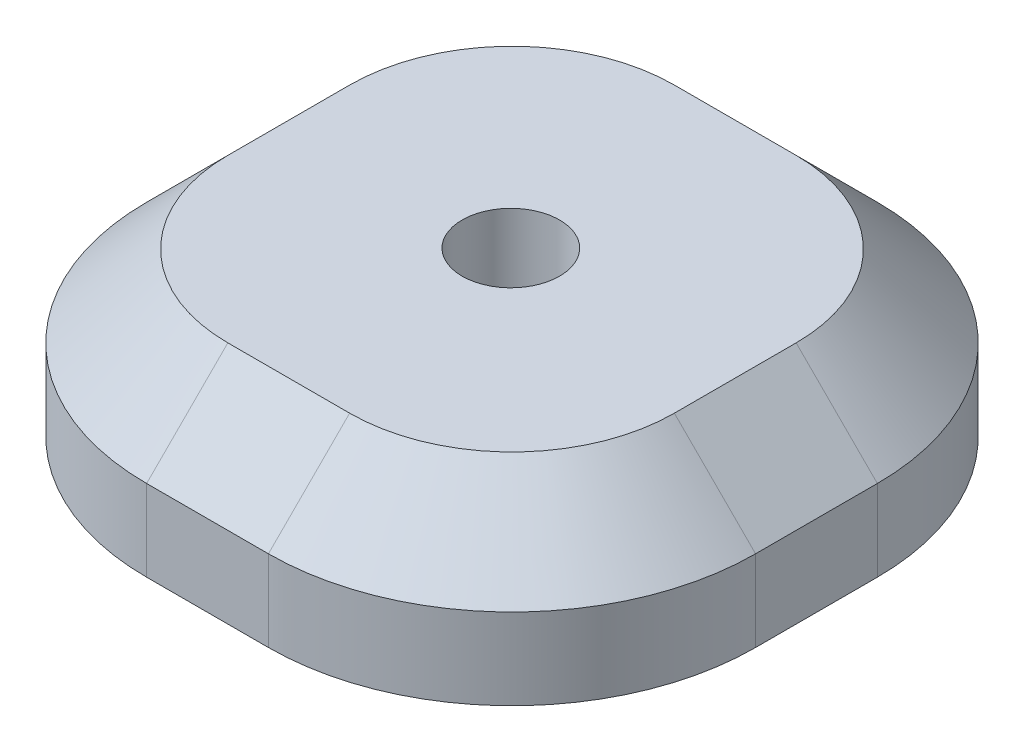
ISO-10303-21;
HEADER;
FILE_DESCRIPTION(('STEP AP214'),'2;1');
FILE_NAME('part.step','',(''),(''),'','','');
FILE_SCHEMA(('AUTOMOTIVE_DESIGN { 1 0 10303 214 1 1 1 1 }'));
ENDSEC;
DATA;
#1=APPLICATION_CONTEXT('core data for automotive mechanical design processes');
#2=APPLICATION_PROTOCOL_DEFINITION('international standard','automotive_design',2000,#1);
#3=PRODUCT_CONTEXT('',#1,'mechanical');
#4=PRODUCT('Part','Part','',(#3));
#5=PRODUCT_RELATED_PRODUCT_CATEGORY('part','',(#4));
#6=PRODUCT_DEFINITION_FORMATION('','',#4);
#7=PRODUCT_DEFINITION_CONTEXT('part definition',#1,'design');
#8=PRODUCT_DEFINITION('design','',#6,#7);
#9=PRODUCT_DEFINITION_SHAPE('','',#8);
#10=(LENGTH_UNIT() NAMED_UNIT(*) SI_UNIT(.MILLI.,.METRE.));
#11=(NAMED_UNIT(*) PLANE_ANGLE_UNIT() SI_UNIT($,.RADIAN.));
#12=(NAMED_UNIT(*) SI_UNIT($,.STERADIAN.) SOLID_ANGLE_UNIT());
#13=UNCERTAINTY_MEASURE_WITH_UNIT(LENGTH_MEASURE(1.E-05),#10,'distance_accuracy_value','');
#14=(GEOMETRIC_REPRESENTATION_CONTEXT(3) GLOBAL_UNCERTAINTY_ASSIGNED_CONTEXT((#13)) GLOBAL_UNIT_ASSIGNED_CONTEXT((#10,
#11,#12)) REPRESENTATION_CONTEXT('',''));
#15=CARTESIAN_POINT('',(0.,0.,0.));
#16=DIRECTION('',(0.,0.,1.));
#17=DIRECTION('',(1.,0.,0.));
#18=AXIS2_PLACEMENT_3D('',#15,#16,#17);
#19=CARTESIAN_POINT('',(0.,20.,0.));
#20=DIRECTION('',(1.,0.,0.));
#21=DIRECTION('',(0.,0.,-1.));
#22=AXIS2_PLACEMENT_3D('',#19,#20,#21);
#23=PLANE('',#22);
#24=DIRECTION('',(0.,-1.,0.));
#25=VECTOR('',#24,1.);
#26=CARTESIAN_POINT('',(0.,20.,-30.));
#27=LINE('',#26,#25);
#28=CARTESIAN_POINT('',(0.,0.,-30.));
#29=VERTEX_POINT('',#28);
#30=CARTESIAN_POINT('',(0.,9.99999999999996,-30.));
#31=VERTEX_POINT('',#30);
#32=EDGE_CURVE('E192',#29,#31,#27,.F.);
#33=ORIENTED_EDGE('',*,*,#32,.T.);
#34=DIRECTION('',(0.,0.,-1.));
#35=VECTOR('',#34,1.);
#36=CARTESIAN_POINT('',(0.,9.99999999999996,0.));
#37=LINE('',#36,#35);
#38=CARTESIAN_POINT('',(0.,9.99999999999996,-45.));
#39=VERTEX_POINT('',#38);
#40=EDGE_CURVE('E236',#31,#39,#37,.T.);
#41=ORIENTED_EDGE('',*,*,#40,.T.);
#42=DIRECTION('',(0.,-1.,0.));
#43=VECTOR('',#42,1.);
#44=CARTESIAN_POINT('',(0.,20.,-45.));
#45=LINE('',#44,#43);
#46=CARTESIAN_POINT('',(0.,0.,-45.));
#47=VERTEX_POINT('',#46);
#48=EDGE_CURVE('E195',#39,#47,#45,.T.);
#49=ORIENTED_EDGE('',*,*,#48,.T.);
#50=DIRECTION('',(0.,0.,1.));
#51=VECTOR('',#50,1.);
#52=CARTESIAN_POINT('',(0.,0.,0.));
#53=LINE('',#52,#51);
#54=EDGE_CURVE('E180',#47,#29,#53,.T.);
#55=ORIENTED_EDGE('',*,*,#54,.T.);
#56=EDGE_LOOP('',(#33,#41,#49,#55));
#57=FACE_BOUND('',#56,.T.);
#58=ADVANCED_FACE('F37',(#57),#23,.F.);
#59=CARTESIAN_POINT('',(0.,20.,0.));
#60=DIRECTION('',(0.,0.,-1.));
#61=DIRECTION('',(-1.,0.,0.));
#62=AXIS2_PLACEMENT_3D('',#59,#60,#61);
#63=PLANE('',#62);
#64=DIRECTION('',(0.,-1.,0.));
#65=VECTOR('',#64,1.);
#66=CARTESIAN_POINT('',(45.,20.,0.));
#67=LINE('',#66,#65);
#68=CARTESIAN_POINT('',(45.,0.,0.));
#69=VERTEX_POINT('',#68);
#70=CARTESIAN_POINT('',(45.,9.99999999999996,0.));
#71=VERTEX_POINT('',#70);
#72=EDGE_CURVE('E216',#69,#71,#67,.F.);
#73=ORIENTED_EDGE('',*,*,#72,.T.);
#74=DIRECTION('',(-1.,0.,0.));
#75=VECTOR('',#74,1.);
#76=CARTESIAN_POINT('',(0.,9.99999999999996,0.));
#77=LINE('',#76,#75);
#78=CARTESIAN_POINT('',(30.,9.99999999999996,0.));
#79=VERTEX_POINT('',#78);
#80=EDGE_CURVE('E243',#71,#79,#77,.T.);
#81=ORIENTED_EDGE('',*,*,#80,.T.);
#82=DIRECTION('',(0.,-1.,0.));
#83=VECTOR('',#82,1.);
#84=CARTESIAN_POINT('',(30.,20.,0.));
#85=LINE('',#84,#83);
#86=CARTESIAN_POINT('',(30.,0.,0.));
#87=VERTEX_POINT('',#86);
#88=EDGE_CURVE('E214',#79,#87,#85,.T.);
#89=ORIENTED_EDGE('',*,*,#88,.T.);
#90=DIRECTION('',(1.,0.,0.));
#91=VECTOR('',#90,1.);
#92=CARTESIAN_POINT('',(0.,0.,0.));
#93=LINE('',#92,#91);
#94=EDGE_CURVE('E183',#87,#69,#93,.T.);
#95=ORIENTED_EDGE('',*,*,#94,.T.);
#96=EDGE_LOOP('',(#73,#81,#89,#95));
#97=FACE_BOUND('',#96,.T.);
#98=ADVANCED_FACE('F286',(#97),#63,.F.);
#99=CARTESIAN_POINT('',(75.,20.,0.));
#100=DIRECTION('',(-1.,0.,0.));
#101=DIRECTION('',(0.,0.,1.));
#102=AXIS2_PLACEMENT_3D('',#99,#100,#101);
#103=PLANE('',#102);
#104=DIRECTION('',(0.,-1.,0.));
#105=VECTOR('',#104,1.);
#106=CARTESIAN_POINT('',(75.,20.,-45.));
#107=LINE('',#106,#105);
#108=CARTESIAN_POINT('',(75.,0.,-45.));
#109=VERTEX_POINT('',#108);
#110=CARTESIAN_POINT('',(75.,9.99999999999996,-45.));
#111=VERTEX_POINT('',#110);
#112=EDGE_CURVE('E212',#109,#111,#107,.F.);
#113=ORIENTED_EDGE('',*,*,#112,.T.);
#114=DIRECTION('',(0.,0.,1.));
#115=VECTOR('',#114,1.);
#116=CARTESIAN_POINT('',(75.,9.99999999999996,0.));
#117=LINE('',#116,#115);
#118=CARTESIAN_POINT('',(75.,9.99999999999996,-30.));
#119=VERTEX_POINT('',#118);
#120=EDGE_CURVE('E11',#111,#119,#117,.T.);
#121=ORIENTED_EDGE('',*,*,#120,.T.);
#122=DIRECTION('',(0.,-1.,0.));
#123=VECTOR('',#122,1.);
#124=CARTESIAN_POINT('',(75.,20.,-30.));
#125=LINE('',#124,#123);
#126=CARTESIAN_POINT('',(75.,0.,-30.));
#127=VERTEX_POINT('',#126);
#128=EDGE_CURVE('E210',#119,#127,#125,.T.);
#129=ORIENTED_EDGE('',*,*,#128,.T.);
#130=DIRECTION('',(0.,0.,-1.));
#131=VECTOR('',#130,1.);
#132=CARTESIAN_POINT('',(75.,0.,0.));
#133=LINE('',#132,#131);
#134=EDGE_CURVE('E186',#127,#109,#133,.T.);
#135=ORIENTED_EDGE('',*,*,#134,.T.);
#136=EDGE_LOOP('',(#113,#121,#129,#135));
#137=FACE_BOUND('',#136,.T.);
#138=ADVANCED_FACE('F296',(#137),#103,.F.);
#139=CARTESIAN_POINT('',(0.,20.,-75.));
#140=DIRECTION('',(0.,0.,1.));
#141=DIRECTION('',(1.,0.,0.));
#142=AXIS2_PLACEMENT_3D('',#139,#140,#141);
#143=PLANE('',#142);
#144=DIRECTION('',(0.,-1.,0.));
#145=VECTOR('',#144,1.);
#146=CARTESIAN_POINT('',(30.,20.,-75.));
#147=LINE('',#146,#145);
#148=CARTESIAN_POINT('',(30.,0.,-75.));
#149=VERTEX_POINT('',#148);
#150=CARTESIAN_POINT('',(30.,9.99999999999996,-75.));
#151=VERTEX_POINT('',#150);
#152=EDGE_CURVE('E207',#149,#151,#147,.F.);
#153=ORIENTED_EDGE('',*,*,#152,.T.);
#154=DIRECTION('',(1.,0.,0.));
#155=VECTOR('',#154,1.);
#156=CARTESIAN_POINT('',(0.,9.99999999999996,-75.));
#157=LINE('',#156,#155);
#158=CARTESIAN_POINT('',(45.,9.99999999999996,-75.));
#159=VERTEX_POINT('',#158);
#160=EDGE_CURVE('E245',#151,#159,#157,.T.);
#161=ORIENTED_EDGE('',*,*,#160,.T.);
#162=DIRECTION('',(0.,-1.,0.));
#163=VECTOR('',#162,1.);
#164=CARTESIAN_POINT('',(45.,20.,-75.));
#165=LINE('',#164,#163);
#166=CARTESIAN_POINT('',(45.,0.,-75.));
#167=VERTEX_POINT('',#166);
#168=EDGE_CURVE('E205',#159,#167,#165,.T.);
#169=ORIENTED_EDGE('',*,*,#168,.T.);
#170=DIRECTION('',(-1.,0.,0.));
#171=VECTOR('',#170,1.);
#172=CARTESIAN_POINT('',(0.,0.,-75.));
#173=LINE('',#172,#171);
#174=EDGE_CURVE('E189',#167,#149,#173,.T.);
#175=ORIENTED_EDGE('',*,*,#174,.T.);
#176=EDGE_LOOP('',(#153,#161,#169,#175));
#177=FACE_BOUND('',#176,.T.);
#178=ADVANCED_FACE('F301',(#177),#143,.F.);
#179=CARTESIAN_POINT('',(0.,20.,0.));
#180=DIRECTION('',(0.,-1.,0.));
#181=DIRECTION('',(0.,0.,-1.));
#182=AXIS2_PLACEMENT_3D('',#179,#180,#181);
#183=PLANE('',#182);
#184=CARTESIAN_POINT('',(37.318018893302,20.,-37.5396086087108));
#185=DIRECTION('',(0.,1.,0.));
#186=DIRECTION('',(0.,0.,1.));
#187=AXIS2_PLACEMENT_3D('',#184,#185,#186);
#188=CIRCLE('',#187,5.99999999999999);
#189=CARTESIAN_POINT('',(37.318018893302,20.,-31.5396086087108));
#190=VERTEX_POINT('',#189);
#191=EDGE_CURVE('E151',#190,#190,#188,.T.);
#192=ORIENTED_EDGE('',*,*,#191,.F.);
#193=EDGE_LOOP('',(#192));
#194=FACE_BOUND('',#193,.T.);
#195=CARTESIAN_POINT('',(30.,20.,-45.));
#196=DIRECTION('',(0.,-1.,0.));
#197=DIRECTION('',(0.,0.,-1.));
#198=AXIS2_PLACEMENT_3D('',#195,#196,#197);
#199=CIRCLE('',#198,20.);
#200=CARTESIAN_POINT('',(30.,20.,-65.));
#201=VERTEX_POINT('',#200);
#202=CARTESIAN_POINT('',(9.99999999999998,20.,-45.));
#203=VERTEX_POINT('',#202);
#204=EDGE_CURVE('E229',#201,#203,#199,.F.);
#205=ORIENTED_EDGE('',*,*,#204,.T.);
#206=DIRECTION('',(0.,0.,1.));
#207=VECTOR('',#206,1.);
#208=CARTESIAN_POINT('',(9.99999999999998,20.,0.));
#209=LINE('',#208,#207);
#210=CARTESIAN_POINT('',(9.99999999999998,20.,-30.));
#211=VERTEX_POINT('',#210);
#212=EDGE_CURVE('E233',#203,#211,#209,.T.);
#213=ORIENTED_EDGE('',*,*,#212,.T.);
#214=CARTESIAN_POINT('',(30.,20.,-30.));
#215=DIRECTION('',(0.,-1.,0.));
#216=DIRECTION('',(0.,0.,-1.));
#217=AXIS2_PLACEMENT_3D('',#214,#215,#216);
#218=CIRCLE('',#217,20.);
#219=CARTESIAN_POINT('',(30.,20.,-9.99999999999998));
#220=VERTEX_POINT('',#219);
#221=EDGE_CURVE('E231',#211,#220,#218,.F.);
#222=ORIENTED_EDGE('',*,*,#221,.T.);
#223=DIRECTION('',(1.,0.,0.));
#224=VECTOR('',#223,1.);
#225=CARTESIAN_POINT('',(0.,20.,-9.99999999999998));
#226=LINE('',#225,#224);
#227=CARTESIAN_POINT('',(45.,20.,-9.99999999999998));
#228=VERTEX_POINT('',#227);
#229=EDGE_CURVE('E227',#220,#228,#226,.T.);
#230=ORIENTED_EDGE('',*,*,#229,.T.);
#231=CARTESIAN_POINT('',(45.,20.,-30.));
#232=DIRECTION('',(0.,-1.,0.));
#233=DIRECTION('',(0.,0.,-1.));
#234=AXIS2_PLACEMENT_3D('',#231,#232,#233);
#235=CIRCLE('',#234,20.);
#236=CARTESIAN_POINT('',(65.,20.,-30.));
#237=VERTEX_POINT('',#236);
#238=EDGE_CURVE('E223',#228,#237,#235,.F.);
#239=ORIENTED_EDGE('',*,*,#238,.T.);
#240=DIRECTION('',(0.,0.,-1.));
#241=VECTOR('',#240,1.);
#242=CARTESIAN_POINT('',(65.,20.,0.));
#243=LINE('',#242,#241);
#244=CARTESIAN_POINT('',(65.,20.,-45.));
#245=VERTEX_POINT('',#244);
#246=EDGE_CURVE('E219',#237,#245,#243,.T.);
#247=ORIENTED_EDGE('',*,*,#246,.T.);
#248=CARTESIAN_POINT('',(45.,20.,-45.));
#249=DIRECTION('',(0.,-1.,0.));
#250=DIRECTION('',(0.,0.,-1.));
#251=AXIS2_PLACEMENT_3D('',#248,#249,#250);
#252=CIRCLE('',#251,20.);
#253=CARTESIAN_POINT('',(45.,20.,-65.));
#254=VERTEX_POINT('',#253);
#255=EDGE_CURVE('E221',#245,#254,#252,.F.);
#256=ORIENTED_EDGE('',*,*,#255,.T.);
#257=DIRECTION('',(-1.,0.,0.));
#258=VECTOR('',#257,1.);
#259=CARTESIAN_POINT('',(0.,20.,-65.));
#260=LINE('',#259,#258);
#261=EDGE_CURVE('E225',#254,#201,#260,.T.);
#262=ORIENTED_EDGE('',*,*,#261,.T.);
#263=EDGE_LOOP('',(#205,#213,#222,#230,#239,#247,#256,#262));
#264=FACE_BOUND('',#263,.T.);
#265=ADVANCED_FACE('F326',(#194,#264),#183,.F.);
#266=CARTESIAN_POINT('',(0.,0.,0.));
#267=DIRECTION('',(0.,-1.,0.));
#268=DIRECTION('',(0.,0.,-1.));
#269=AXIS2_PLACEMENT_3D('',#266,#267,#268);
#270=PLANE('',#269);
#271=CARTESIAN_POINT('',(25.,0.,-25.));
#272=DIRECTION('',(0.,-1.,0.));
#273=DIRECTION('',(0.,0.,-1.));
#274=AXIS2_PLACEMENT_3D('',#271,#272,#273);
#275=CIRCLE('',#274,5.99999999999999);
#276=CARTESIAN_POINT('',(25.,0.,-31.));
#277=VERTEX_POINT('',#276);
#278=EDGE_CURVE('E150',#277,#277,#275,.T.);
#279=ORIENTED_EDGE('',*,*,#278,.F.);
#280=EDGE_LOOP('',(#279));
#281=FACE_BOUND('',#280,.T.);
#282=CARTESIAN_POINT('',(50.,0.,-25.));
#283=DIRECTION('',(0.,-1.,0.));
#284=DIRECTION('',(0.,0.,-1.));
#285=AXIS2_PLACEMENT_3D('',#282,#283,#284);
#286=CIRCLE('',#285,5.99999999999998);
#287=CARTESIAN_POINT('',(50.,0.,-31.));
#288=VERTEX_POINT('',#287);
#289=EDGE_CURVE('E161',#288,#288,#286,.T.);
#290=ORIENTED_EDGE('',*,*,#289,.F.);
#291=EDGE_LOOP('',(#290));
#292=FACE_BOUND('',#291,.T.);
#293=CARTESIAN_POINT('',(50.,0.,-50.));
#294=DIRECTION('',(0.,-1.,0.));
#295=DIRECTION('',(0.,0.,-1.));
#296=AXIS2_PLACEMENT_3D('',#293,#294,#295);
#297=CIRCLE('',#296,5.99999999999998);
#298=CARTESIAN_POINT('',(50.,0.,-56.));
#299=VERTEX_POINT('',#298);
#300=EDGE_CURVE('E167',#299,#299,#297,.T.);
#301=ORIENTED_EDGE('',*,*,#300,.F.);
#302=EDGE_LOOP('',(#301));
#303=FACE_BOUND('',#302,.T.);
#304=CARTESIAN_POINT('',(25.,0.,-50.));
#305=DIRECTION('',(0.,-1.,0.));
#306=DIRECTION('',(0.,0.,-1.));
#307=AXIS2_PLACEMENT_3D('',#304,#305,#306);
#308=CIRCLE('',#307,5.99999999999999);
#309=CARTESIAN_POINT('',(25.,0.,-56.));
#310=VERTEX_POINT('',#309);
#311=EDGE_CURVE('E173',#310,#310,#308,.T.);
#312=ORIENTED_EDGE('',*,*,#311,.F.);
#313=EDGE_LOOP('',(#312));
#314=FACE_BOUND('',#313,.T.);
#315=ORIENTED_EDGE('',*,*,#54,.F.);
#316=CARTESIAN_POINT('',(30.,0.,-45.));
#317=DIRECTION('',(0.,-1.,0.));
#318=DIRECTION('',(0.,0.,-1.));
#319=AXIS2_PLACEMENT_3D('',#316,#317,#318);
#320=CIRCLE('',#319,30.);
#321=EDGE_CURVE('E203',#47,#149,#320,.T.);
#322=ORIENTED_EDGE('',*,*,#321,.T.);
#323=ORIENTED_EDGE('',*,*,#174,.F.);
#324=CARTESIAN_POINT('',(45.,0.,-45.));
#325=DIRECTION('',(0.,-1.,0.));
#326=DIRECTION('',(0.,0.,-1.));
#327=AXIS2_PLACEMENT_3D('',#324,#325,#326);
#328=CIRCLE('',#327,30.);
#329=EDGE_CURVE('E201',#167,#109,#328,.T.);
#330=ORIENTED_EDGE('',*,*,#329,.T.);
#331=ORIENTED_EDGE('',*,*,#134,.F.);
#332=CARTESIAN_POINT('',(45.,0.,-30.));
#333=DIRECTION('',(0.,-1.,0.));
#334=DIRECTION('',(0.,0.,-1.));
#335=AXIS2_PLACEMENT_3D('',#332,#333,#334);
#336=CIRCLE('',#335,30.);
#337=EDGE_CURVE('E199',#127,#69,#336,.T.);
#338=ORIENTED_EDGE('',*,*,#337,.T.);
#339=ORIENTED_EDGE('',*,*,#94,.F.);
#340=CARTESIAN_POINT('',(30.,0.,-30.));
#341=DIRECTION('',(0.,-1.,0.));
#342=DIRECTION('',(0.,0.,-1.));
#343=AXIS2_PLACEMENT_3D('',#340,#341,#342);
#344=CIRCLE('',#343,30.);
#345=EDGE_CURVE('E197',#87,#29,#344,.T.);
#346=ORIENTED_EDGE('',*,*,#345,.T.);
#347=EDGE_LOOP('',(#315,#322,#323,#330,#331,#338,#339,#346));
#348=FACE_BOUND('',#347,.T.);
#349=ADVANCED_FACE('F292',(#281,#292,#303,#314,#348),#270,.T.);
#350=CARTESIAN_POINT('',(30.,20.,-45.));
#351=DIRECTION('',(0.,-1.,0.));
#352=DIRECTION('',(0.,0.,-1.));
#353=AXIS2_PLACEMENT_3D('',#350,#351,#352);
#354=CYLINDRICAL_SURFACE('',#353,30.);
#355=ORIENTED_EDGE('',*,*,#48,.F.);
#356=CARTESIAN_POINT('',(30.,9.99999999999996,-45.));
#357=DIRECTION('',(0.,-1.,0.));
#358=DIRECTION('',(0.,0.,-1.));
#359=AXIS2_PLACEMENT_3D('',#356,#357,#358);
#360=CIRCLE('',#359,30.);
#361=EDGE_CURVE('E241',#39,#151,#360,.T.);
#362=ORIENTED_EDGE('',*,*,#361,.T.);
#363=ORIENTED_EDGE('',*,*,#152,.F.);
#364=ORIENTED_EDGE('',*,*,#321,.F.);
#365=EDGE_LOOP('',(#355,#362,#363,#364));
#366=FACE_BOUND('',#365,.T.);
#367=ADVANCED_FACE('F305',(#366),#354,.T.);
#368=CARTESIAN_POINT('',(45.,20.,-45.));
#369=DIRECTION('',(0.,-1.,0.));
#370=DIRECTION('',(0.,0.,-1.));
#371=AXIS2_PLACEMENT_3D('',#368,#369,#370);
#372=CYLINDRICAL_SURFACE('',#371,30.);
#373=ORIENTED_EDGE('',*,*,#168,.F.);
#374=CARTESIAN_POINT('',(45.,9.99999999999996,-45.));
#375=DIRECTION('',(0.,-1.,0.));
#376=DIRECTION('',(0.,0.,-1.));
#377=AXIS2_PLACEMENT_3D('',#374,#375,#376);
#378=CIRCLE('',#377,30.);
#379=EDGE_CURVE('E46',#159,#111,#378,.T.);
#380=ORIENTED_EDGE('',*,*,#379,.T.);
#381=ORIENTED_EDGE('',*,*,#112,.F.);
#382=ORIENTED_EDGE('',*,*,#329,.F.);
#383=EDGE_LOOP('',(#373,#380,#381,#382));
#384=FACE_BOUND('',#383,.T.);
#385=ADVANCED_FACE('F297',(#384),#372,.T.);
#386=CARTESIAN_POINT('',(45.,20.,-30.));
#387=DIRECTION('',(0.,-1.,0.));
#388=DIRECTION('',(0.,0.,-1.));
#389=AXIS2_PLACEMENT_3D('',#386,#387,#388);
#390=CYLINDRICAL_SURFACE('',#389,30.);
#391=ORIENTED_EDGE('',*,*,#128,.F.);
#392=CARTESIAN_POINT('',(45.,9.99999999999996,-30.));
#393=DIRECTION('',(0.,-1.,0.));
#394=DIRECTION('',(0.,0.,-1.));
#395=AXIS2_PLACEMENT_3D('',#392,#393,#394);
#396=CIRCLE('',#395,30.);
#397=EDGE_CURVE('E247',#119,#71,#396,.T.);
#398=ORIENTED_EDGE('',*,*,#397,.T.);
#399=ORIENTED_EDGE('',*,*,#72,.F.);
#400=ORIENTED_EDGE('',*,*,#337,.F.);
#401=EDGE_LOOP('',(#391,#398,#399,#400));
#402=FACE_BOUND('',#401,.T.);
#403=ADVANCED_FACE('F283',(#402),#390,.T.);
#404=CARTESIAN_POINT('',(30.,20.,-30.));
#405=DIRECTION('',(0.,-1.,0.));
#406=DIRECTION('',(0.,0.,-1.));
#407=AXIS2_PLACEMENT_3D('',#404,#405,#406);
#408=CYLINDRICAL_SURFACE('',#407,30.);
#409=ORIENTED_EDGE('',*,*,#88,.F.);
#410=CARTESIAN_POINT('',(30.,9.99999999999996,-30.));
#411=DIRECTION('',(0.,-1.,0.));
#412=DIRECTION('',(0.,0.,-1.));
#413=AXIS2_PLACEMENT_3D('',#410,#411,#412);
#414=CIRCLE('',#413,30.);
#415=EDGE_CURVE('E239',#79,#31,#414,.T.);
#416=ORIENTED_EDGE('',*,*,#415,.T.);
#417=ORIENTED_EDGE('',*,*,#32,.F.);
#418=ORIENTED_EDGE('',*,*,#345,.F.);
#419=EDGE_LOOP('',(#409,#416,#417,#418));
#420=FACE_BOUND('',#419,.T.);
#421=ADVANCED_FACE('F354',(#420),#408,.T.);
#422=CARTESIAN_POINT('',(65.,20.,0.));
#423=DIRECTION('',(-0.707106781186549,-0.707106781186545,0.));
#424=DIRECTION('',(0.,0.,-1.));
#425=AXIS2_PLACEMENT_3D('',#422,#423,#424);
#426=PLANE('',#425);
#427=DIRECTION('',(-0.707106781186545,0.70710678118655,0.));
#428=VECTOR('',#427,1.);
#429=CARTESIAN_POINT('',(75.,9.99999999999996,-30.));
#430=LINE('',#429,#428);
#431=EDGE_CURVE('E264',#119,#237,#430,.T.);
#432=ORIENTED_EDGE('',*,*,#431,.F.);
#433=ORIENTED_EDGE('',*,*,#120,.F.);
#434=DIRECTION('',(0.707106781186545,-0.70710678118655,0.));
#435=VECTOR('',#434,1.);
#436=CARTESIAN_POINT('',(65.,20.,-45.));
#437=LINE('',#436,#435);
#438=EDGE_CURVE('E41',#245,#111,#437,.T.);
#439=ORIENTED_EDGE('',*,*,#438,.F.);
#440=ORIENTED_EDGE('',*,*,#246,.F.);
#441=EDGE_LOOP('',(#432,#433,#439,#440));
#442=FACE_BOUND('',#441,.T.);
#443=ADVANCED_FACE('F39',(#442),#426,.F.);
#444=CARTESIAN_POINT('',(45.,20.,-45.));
#445=DIRECTION('',(0.,-1.,0.));
#446=DIRECTION('',(0.,0.,-1.));
#447=AXIS2_PLACEMENT_3D('',#444,#445,#446);
#448=CONICAL_SURFACE('',#447,20.,0.785398163397446);
#449=ORIENTED_EDGE('',*,*,#438,.T.);
#450=ORIENTED_EDGE('',*,*,#379,.F.);
#451=DIRECTION('',(0.,-0.707106781186549,-0.707106781186545));
#452=VECTOR('',#451,1.);
#453=CARTESIAN_POINT('',(45.,20.,-65.));
#454=LINE('',#453,#452);
#455=EDGE_CURVE('E262',#254,#159,#454,.T.);
#456=ORIENTED_EDGE('',*,*,#455,.F.);
#457=ORIENTED_EDGE('',*,*,#255,.F.);
#458=EDGE_LOOP('',(#449,#450,#456,#457));
#459=FACE_BOUND('',#458,.T.);
#460=ADVANCED_FACE('F274',(#459),#448,.T.);
#461=CARTESIAN_POINT('',(45.,20.,-30.));
#462=DIRECTION('',(0.,-1.,0.));
#463=DIRECTION('',(0.,0.,-1.));
#464=AXIS2_PLACEMENT_3D('',#461,#462,#463);
#465=CONICAL_SURFACE('',#464,20.,0.785398163397446);
#466=ORIENTED_EDGE('',*,*,#431,.T.);
#467=ORIENTED_EDGE('',*,*,#238,.F.);
#468=DIRECTION('',(0.,0.707106781186549,-0.707106781186545));
#469=VECTOR('',#468,1.);
#470=CARTESIAN_POINT('',(45.,9.99999999999996,0.));
#471=LINE('',#470,#469);
#472=EDGE_CURVE('E259',#71,#228,#471,.T.);
#473=ORIENTED_EDGE('',*,*,#472,.F.);
#474=ORIENTED_EDGE('',*,*,#397,.F.);
#475=EDGE_LOOP('',(#466,#467,#473,#474));
#476=FACE_BOUND('',#475,.T.);
#477=ADVANCED_FACE('F279',(#476),#465,.T.);
#478=CARTESIAN_POINT('',(0.,20.,-65.));
#479=DIRECTION('',(0.,-0.707106781186545,0.707106781186549));
#480=DIRECTION('',(-1.,0.,0.));
#481=AXIS2_PLACEMENT_3D('',#478,#479,#480);
#482=PLANE('',#481);
#483=ORIENTED_EDGE('',*,*,#455,.T.);
#484=ORIENTED_EDGE('',*,*,#160,.F.);
#485=DIRECTION('',(0.,-0.70710678118655,-0.707106781186545));
#486=VECTOR('',#485,1.);
#487=CARTESIAN_POINT('',(30.,20.,-65.));
#488=LINE('',#487,#486);
#489=EDGE_CURVE('E256',#201,#151,#488,.T.);
#490=ORIENTED_EDGE('',*,*,#489,.F.);
#491=ORIENTED_EDGE('',*,*,#261,.F.);
#492=EDGE_LOOP('',(#483,#484,#490,#491));
#493=FACE_BOUND('',#492,.T.);
#494=ADVANCED_FACE('F329',(#493),#482,.F.);
#495=CARTESIAN_POINT('',(0.,20.,-9.99999999999998));
#496=DIRECTION('',(0.,-0.707106781186545,-0.707106781186549));
#497=DIRECTION('',(1.,0.,0.));
#498=AXIS2_PLACEMENT_3D('',#495,#496,#497);
#499=PLANE('',#498);
#500=ORIENTED_EDGE('',*,*,#472,.T.);
#501=ORIENTED_EDGE('',*,*,#229,.F.);
#502=DIRECTION('',(0.,0.70710678118655,-0.707106781186545));
#503=VECTOR('',#502,1.);
#504=CARTESIAN_POINT('',(30.,9.99999999999996,0.));
#505=LINE('',#504,#503);
#506=EDGE_CURVE('E253',#79,#220,#505,.T.);
#507=ORIENTED_EDGE('',*,*,#506,.F.);
#508=ORIENTED_EDGE('',*,*,#80,.F.);
#509=EDGE_LOOP('',(#500,#501,#507,#508));
#510=FACE_BOUND('',#509,.T.);
#511=ADVANCED_FACE('F331',(#510),#499,.F.);
#512=CARTESIAN_POINT('',(30.,20.,-45.));
#513=DIRECTION('',(0.,-1.,0.));
#514=DIRECTION('',(0.,0.,-1.));
#515=AXIS2_PLACEMENT_3D('',#512,#513,#514);
#516=CONICAL_SURFACE('',#515,20.,0.785398163397446);
#517=ORIENTED_EDGE('',*,*,#489,.T.);
#518=ORIENTED_EDGE('',*,*,#361,.F.);
#519=DIRECTION('',(-0.707106781186545,-0.707106781186549,0.));
#520=VECTOR('',#519,1.);
#521=CARTESIAN_POINT('',(9.99999999999998,20.,-45.));
#522=LINE('',#521,#520);
#523=EDGE_CURVE('E251',#203,#39,#522,.T.);
#524=ORIENTED_EDGE('',*,*,#523,.F.);
#525=ORIENTED_EDGE('',*,*,#204,.F.);
#526=EDGE_LOOP('',(#517,#518,#524,#525));
#527=FACE_BOUND('',#526,.T.);
#528=ADVANCED_FACE('F309',(#527),#516,.T.);
#529=CARTESIAN_POINT('',(30.,20.,-30.));
#530=DIRECTION('',(0.,-1.,0.));
#531=DIRECTION('',(0.,0.,-1.));
#532=AXIS2_PLACEMENT_3D('',#529,#530,#531);
#533=CONICAL_SURFACE('',#532,20.,0.785398163397446);
#534=ORIENTED_EDGE('',*,*,#506,.T.);
#535=ORIENTED_EDGE('',*,*,#221,.F.);
#536=DIRECTION('',(0.707106781186545,0.707106781186549,0.));
#537=VECTOR('',#536,1.);
#538=CARTESIAN_POINT('',(0.,9.99999999999996,-30.));
#539=LINE('',#538,#537);
#540=EDGE_CURVE('E179',#31,#211,#539,.T.);
#541=ORIENTED_EDGE('',*,*,#540,.F.);
#542=ORIENTED_EDGE('',*,*,#415,.F.);
#543=EDGE_LOOP('',(#534,#535,#541,#542));
#544=FACE_BOUND('',#543,.T.);
#545=ADVANCED_FACE('F322',(#544),#533,.T.);
#546=CARTESIAN_POINT('',(9.99999999999998,20.,0.));
#547=DIRECTION('',(0.707106781186549,-0.707106781186545,0.));
#548=DIRECTION('',(0.,0.,1.));
#549=AXIS2_PLACEMENT_3D('',#546,#547,#548);
#550=PLANE('',#549);
#551=ORIENTED_EDGE('',*,*,#523,.T.);
#552=ORIENTED_EDGE('',*,*,#40,.F.);
#553=ORIENTED_EDGE('',*,*,#540,.T.);
#554=ORIENTED_EDGE('',*,*,#212,.F.);
#555=EDGE_LOOP('',(#551,#552,#553,#554));
#556=FACE_BOUND('',#555,.T.);
#557=ADVANCED_FACE('F318',(#556),#550,.F.);
#558=CARTESIAN_POINT('',(25.,9.99999999999999,-50.));
#559=DIRECTION('',(0.,-1.,0.));
#560=DIRECTION('',(0.,0.,-1.));
#561=AXIS2_PLACEMENT_3D('',#558,#559,#560);
#562=CONICAL_SURFACE('',#561,5.99999999999999,1.02974425867666);
#563=CARTESIAN_POINT('',(25.,13.6051637141653,-50.));
#564=VERTEX_POINT('',#563);
#565=VERTEX_LOOP('',#564);
#566=FACE_BOUND('',#565,.T.);
#567=CARTESIAN_POINT('',(25.,9.99999999999999,-50.));
#568=DIRECTION('',(0.,-1.,0.));
#569=DIRECTION('',(0.,0.,-1.));
#570=AXIS2_PLACEMENT_3D('',#567,#568,#569);
#571=CIRCLE('',#570,5.99999999999999);
#572=CARTESIAN_POINT('',(25.,9.99999999999999,-56.));
#573=VERTEX_POINT('',#572);
#574=EDGE_CURVE('E176',#573,#573,#571,.T.);
#575=ORIENTED_EDGE('',*,*,#574,.T.);
#576=EDGE_LOOP('',(#575));
#577=FACE_BOUND('',#576,.T.);
#578=ADVANCED_FACE('F360',(#566,#577),#562,.F.);
#579=CARTESIAN_POINT('',(25.,0.,-50.));
#580=DIRECTION('',(0.,-1.,0.));
#581=DIRECTION('',(0.,0.,-1.));
#582=AXIS2_PLACEMENT_3D('',#579,#580,#581);
#583=CYLINDRICAL_SURFACE('',#582,5.99999999999999);
#584=ORIENTED_EDGE('',*,*,#574,.F.);
#585=EDGE_LOOP('',(#584));
#586=FACE_BOUND('',#585,.T.);
#587=ORIENTED_EDGE('',*,*,#311,.T.);
#588=EDGE_LOOP('',(#587));
#589=FACE_BOUND('',#588,.T.);
#590=ADVANCED_FACE('F383',(#586,#589),#583,.F.);
#591=CARTESIAN_POINT('',(50.,9.99999999999999,-50.));
#592=DIRECTION('',(0.,-1.,0.));
#593=DIRECTION('',(0.,0.,-1.));
#594=AXIS2_PLACEMENT_3D('',#591,#592,#593);
#595=CONICAL_SURFACE('',#594,5.99999999999998,1.02974425867666);
#596=CARTESIAN_POINT('',(50.,13.6051637141653,-50.));
#597=VERTEX_POINT('',#596);
#598=VERTEX_LOOP('',#597);
#599=FACE_BOUND('',#598,.T.);
#600=CARTESIAN_POINT('',(50.,9.99999999999999,-50.));
#601=DIRECTION('',(0.,-1.,0.));
#602=DIRECTION('',(0.,0.,-1.));
#603=AXIS2_PLACEMENT_3D('',#600,#601,#602);
#604=CIRCLE('',#603,5.99999999999998);
#605=CARTESIAN_POINT('',(50.,9.99999999999999,-56.));
#606=VERTEX_POINT('',#605);
#607=EDGE_CURVE('E170',#606,#606,#604,.T.);
#608=ORIENTED_EDGE('',*,*,#607,.T.);
#609=EDGE_LOOP('',(#608));
#610=FACE_BOUND('',#609,.T.);
#611=ADVANCED_FACE('F391',(#599,#610),#595,.F.);
#612=CARTESIAN_POINT('',(50.,0.,-50.));
#613=DIRECTION('',(0.,-1.,0.));
#614=DIRECTION('',(0.,0.,-1.));
#615=AXIS2_PLACEMENT_3D('',#612,#613,#614);
#616=CYLINDRICAL_SURFACE('',#615,5.99999999999998);
#617=ORIENTED_EDGE('',*,*,#607,.F.);
#618=EDGE_LOOP('',(#617));
#619=FACE_BOUND('',#618,.T.);
#620=ORIENTED_EDGE('',*,*,#300,.T.);
#621=EDGE_LOOP('',(#620));
#622=FACE_BOUND('',#621,.T.);
#623=ADVANCED_FACE('F399',(#619,#622),#616,.F.);
#624=CARTESIAN_POINT('',(50.,9.99999999999999,-25.));
#625=DIRECTION('',(0.,-1.,0.));
#626=DIRECTION('',(0.,0.,-1.));
#627=AXIS2_PLACEMENT_3D('',#624,#625,#626);
#628=CONICAL_SURFACE('',#627,5.99999999999998,1.02974425867666);
#629=CARTESIAN_POINT('',(50.,13.6051637141653,-25.));
#630=VERTEX_POINT('',#629);
#631=VERTEX_LOOP('',#630);
#632=FACE_BOUND('',#631,.T.);
#633=CARTESIAN_POINT('',(50.,9.99999999999999,-25.));
#634=DIRECTION('',(0.,-1.,0.));
#635=DIRECTION('',(0.,0.,-1.));
#636=AXIS2_PLACEMENT_3D('',#633,#634,#635);
#637=CIRCLE('',#636,5.99999999999998);
#638=CARTESIAN_POINT('',(50.,9.99999999999999,-31.));
#639=VERTEX_POINT('',#638);
#640=EDGE_CURVE('E164',#639,#639,#637,.T.);
#641=ORIENTED_EDGE('',*,*,#640,.T.);
#642=EDGE_LOOP('',(#641));
#643=FACE_BOUND('',#642,.T.);
#644=ADVANCED_FACE('F407',(#632,#643),#628,.F.);
#645=CARTESIAN_POINT('',(50.,0.,-25.));
#646=DIRECTION('',(0.,-1.,0.));
#647=DIRECTION('',(0.,0.,-1.));
#648=AXIS2_PLACEMENT_3D('',#645,#646,#647);
#649=CYLINDRICAL_SURFACE('',#648,5.99999999999998);
#650=ORIENTED_EDGE('',*,*,#640,.F.);
#651=EDGE_LOOP('',(#650));
#652=FACE_BOUND('',#651,.T.);
#653=ORIENTED_EDGE('',*,*,#289,.T.);
#654=EDGE_LOOP('',(#653));
#655=FACE_BOUND('',#654,.T.);
#656=ADVANCED_FACE('F415',(#652,#655),#649,.F.);
#657=CARTESIAN_POINT('',(25.,9.99999999999999,-25.));
#658=DIRECTION('',(0.,-1.,0.));
#659=DIRECTION('',(0.,0.,-1.));
#660=AXIS2_PLACEMENT_3D('',#657,#658,#659);
#661=CONICAL_SURFACE('',#660,5.99999999999999,1.02974425867666);
#662=CARTESIAN_POINT('',(25.,13.6051637141653,-25.));
#663=VERTEX_POINT('',#662);
#664=VERTEX_LOOP('',#663);
#665=FACE_BOUND('',#664,.T.);
#666=CARTESIAN_POINT('',(25.,9.99999999999999,-25.));
#667=DIRECTION('',(0.,-1.,0.));
#668=DIRECTION('',(0.,0.,-1.));
#669=AXIS2_PLACEMENT_3D('',#666,#667,#668);
#670=CIRCLE('',#669,5.99999999999999);
#671=CARTESIAN_POINT('',(25.,9.99999999999999,-31.));
#672=VERTEX_POINT('',#671);
#673=EDGE_CURVE('E154',#672,#672,#670,.T.);
#674=ORIENTED_EDGE('',*,*,#673,.T.);
#675=EDGE_LOOP('',(#674));
#676=FACE_BOUND('',#675,.T.);
#677=ADVANCED_FACE('F423',(#665,#676),#661,.F.);
#678=CARTESIAN_POINT('',(25.,0.,-25.));
#679=DIRECTION('',(0.,-1.,0.));
#680=DIRECTION('',(0.,0.,-1.));
#681=AXIS2_PLACEMENT_3D('',#678,#679,#680);
#682=CYLINDRICAL_SURFACE('',#681,5.99999999999999);
#683=ORIENTED_EDGE('',*,*,#673,.F.);
#684=EDGE_LOOP('',(#683));
#685=FACE_BOUND('',#684,.T.);
#686=ORIENTED_EDGE('',*,*,#278,.T.);
#687=EDGE_LOOP('',(#686));
#688=FACE_BOUND('',#687,.T.);
#689=ADVANCED_FACE('F144',(#685,#688),#682,.F.);
#690=CARTESIAN_POINT('',(37.318018893302,10.,-37.5396086087108));
#691=DIRECTION('',(0.,1.,0.));
#692=DIRECTION('',(0.,0.,1.));
#693=AXIS2_PLACEMENT_3D('',#690,#691,#692);
#694=CONICAL_SURFACE('',#693,5.99999999999998,1.02974425867665);
#695=CARTESIAN_POINT('',(37.318018893302,6.39483628583465,-37.5396086087108));
#696=VERTEX_POINT('',#695);
#697=VERTEX_LOOP('',#696);
#698=FACE_BOUND('',#697,.T.);
#699=CARTESIAN_POINT('',(37.318018893302,10.,-37.5396086087108));
#700=DIRECTION('',(0.,1.,0.));
#701=DIRECTION('',(0.,0.,1.));
#702=AXIS2_PLACEMENT_3D('',#699,#700,#701);
#703=CIRCLE('',#702,5.99999999999998);
#704=CARTESIAN_POINT('',(37.318018893302,10.,-31.5396086087108));
#705=VERTEX_POINT('',#704);
#706=EDGE_CURVE('E148',#705,#705,#703,.T.);
#707=ORIENTED_EDGE('',*,*,#706,.T.);
#708=EDGE_LOOP('',(#707));
#709=FACE_BOUND('',#708,.T.);
#710=ADVANCED_FACE('F140',(#698,#709),#694,.F.);
#711=CARTESIAN_POINT('',(37.318018893302,20.,-37.5396086087108));
#712=DIRECTION('',(0.,1.,0.));
#713=DIRECTION('',(0.,0.,1.));
#714=AXIS2_PLACEMENT_3D('',#711,#712,#713);
#715=CYLINDRICAL_SURFACE('',#714,5.99999999999999);
#716=ORIENTED_EDGE('',*,*,#706,.F.);
#717=EDGE_LOOP('',(#716));
#718=FACE_BOUND('',#717,.T.);
#719=ORIENTED_EDGE('',*,*,#191,.T.);
#720=EDGE_LOOP('',(#719));
#721=FACE_BOUND('',#720,.T.);
#722=ADVANCED_FACE('F143',(#718,#721),#715,.F.);
#723=CLOSED_SHELL('',(#58,#98,#138,#178,#265,#349,#367,#385,#403,#421,#443,#460,#477,#494,#511,
#528,#545,#557,#578,#590,#611,#623,#644,#656,#677,#689,#710,#722));
#724=MANIFOLD_SOLID_BREP('B2',#723);
#725=ADVANCED_BREP_SHAPE_REPRESENTATION('',(#18,#724),#14);
#726=SHAPE_DEFINITION_REPRESENTATION(#9,#725);
ENDSEC;
END-ISO-10303-21;
